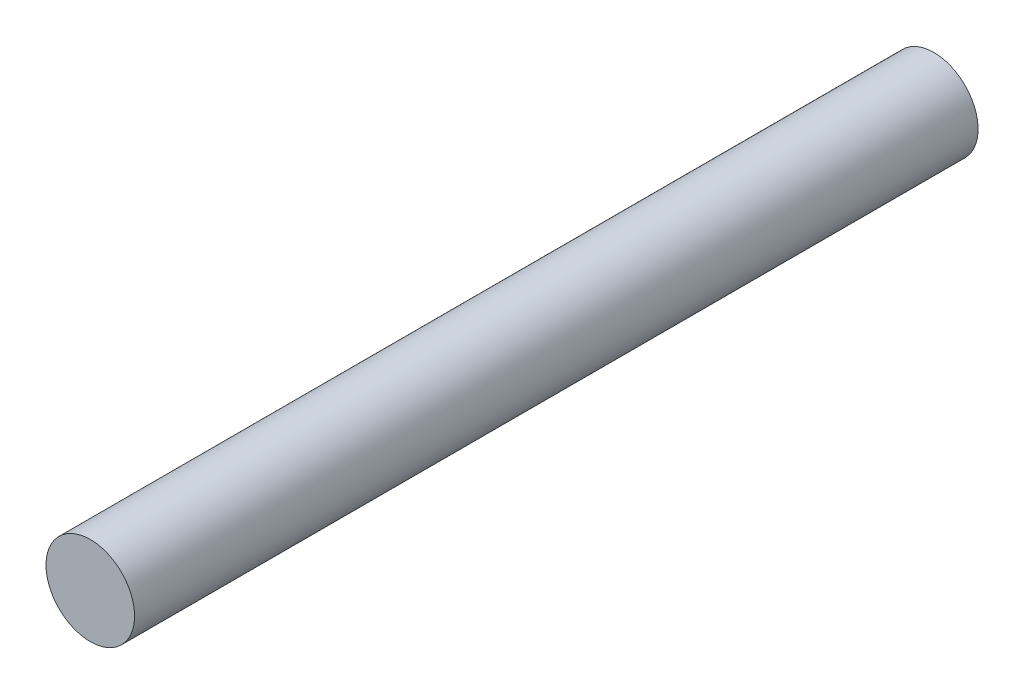
ISO-10303-21;
HEADER;
FILE_DESCRIPTION(('STEP AP214'),'2;1');
FILE_NAME('part.step','',(''),(''),'','','');
FILE_SCHEMA(('AUTOMOTIVE_DESIGN { 1 0 10303 214 1 1 1 1 }'));
ENDSEC;
DATA;
#1=APPLICATION_CONTEXT('core data for automotive mechanical design processes');
#2=APPLICATION_PROTOCOL_DEFINITION('international standard','automotive_design',2000,#1);
#3=PRODUCT_CONTEXT('',#1,'mechanical');
#4=PRODUCT('Part','Part','',(#3));
#5=PRODUCT_RELATED_PRODUCT_CATEGORY('part','',(#4));
#6=PRODUCT_DEFINITION_FORMATION('','',#4);
#7=PRODUCT_DEFINITION_CONTEXT('part definition',#1,'design');
#8=PRODUCT_DEFINITION('design','',#6,#7);
#9=PRODUCT_DEFINITION_SHAPE('','',#8);
#10=(LENGTH_UNIT() NAMED_UNIT(*) SI_UNIT(.MILLI.,.METRE.));
#11=(NAMED_UNIT(*) PLANE_ANGLE_UNIT() SI_UNIT($,.RADIAN.));
#12=(NAMED_UNIT(*) SI_UNIT($,.STERADIAN.) SOLID_ANGLE_UNIT());
#13=UNCERTAINTY_MEASURE_WITH_UNIT(LENGTH_MEASURE(1.E-05),#10,'distance_accuracy_value','');
#14=(GEOMETRIC_REPRESENTATION_CONTEXT(3) GLOBAL_UNCERTAINTY_ASSIGNED_CONTEXT((#13)) GLOBAL_UNIT_ASSIGNED_CONTEXT((#10,
#11,#12)) REPRESENTATION_CONTEXT('',''));
#15=CARTESIAN_POINT('',(0.,0.,0.));
#16=DIRECTION('',(0.,0.,1.));
#17=DIRECTION('',(1.,0.,0.));
#18=AXIS2_PLACEMENT_3D('',#15,#16,#17);
#19=CARTESIAN_POINT('',(0.,0.,19.05));
#20=DIRECTION('',(0.,0.,-1.));
#21=DIRECTION('',(-1.,0.,0.));
#22=AXIS2_PLACEMENT_3D('',#19,#20,#21);
#23=CYLINDRICAL_SURFACE('',#22,2.);
#24=CARTESIAN_POINT('',(0.,0.,19.05));
#25=DIRECTION('',(0.,0.,1.));
#26=DIRECTION('',(1.,0.,0.));
#27=AXIS2_PLACEMENT_3D('',#24,#25,#26);
#28=CIRCLE('',#27,2.);
#29=CARTESIAN_POINT('',(-2.,0.,19.05));
#30=VERTEX_POINT('',#29);
#31=EDGE_CURVE('E10',#30,#30,#28,.T.);
#32=CARTESIAN_POINT('',(0.,0.,-19.05));
#33=DIRECTION('',(0.,0.,1.));
#34=DIRECTION('',(1.,0.,0.));
#35=AXIS2_PLACEMENT_3D('',#32,#33,#34);
#36=CIRCLE('',#35,2.);
#37=CARTESIAN_POINT('',(-2.,0.,-19.05));
#38=VERTEX_POINT('',#37);
#39=EDGE_CURVE('E37',#38,#38,#36,.T.);
#40=CARTESIAN_POINT('',(-2.,0.,19.05));
#41=CARTESIAN_POINT('',(-2.,0.,18.653125));
#42=CARTESIAN_POINT('',(-2.,0.,18.25625));
#43=CARTESIAN_POINT('',(-2.,0.,17.4625));
#44=CARTESIAN_POINT('',(-2.,0.,17.065625));
#45=CARTESIAN_POINT('',(-2.,0.,16.271875));
#46=CARTESIAN_POINT('',(-2.,0.,15.875));
#47=CARTESIAN_POINT('',(-2.,0.,15.08125));
#48=CARTESIAN_POINT('',(-2.,0.,14.684375));
#49=CARTESIAN_POINT('',(-2.,0.,13.890625));
#50=CARTESIAN_POINT('',(-2.,0.,13.49375));
#51=CARTESIAN_POINT('',(-2.,0.,12.7));
#52=CARTESIAN_POINT('',(-2.,0.,12.303125));
#53=CARTESIAN_POINT('',(-2.,0.,11.509375));
#54=CARTESIAN_POINT('',(-2.,0.,11.1125));
#55=CARTESIAN_POINT('',(-2.,0.,10.31875));
#56=CARTESIAN_POINT('',(-2.,0.,9.921875));
#57=CARTESIAN_POINT('',(-2.,0.,9.128125));
#58=CARTESIAN_POINT('',(-2.,0.,8.73125));
#59=CARTESIAN_POINT('',(-2.,0.,7.9375));
#60=CARTESIAN_POINT('',(-2.,0.,7.540625));
#61=CARTESIAN_POINT('',(-2.,0.,6.746875));
#62=CARTESIAN_POINT('',(-2.,0.,6.35));
#63=CARTESIAN_POINT('',(-2.,0.,5.55625));
#64=CARTESIAN_POINT('',(-2.,0.,5.159375));
#65=CARTESIAN_POINT('',(-2.,0.,4.365625));
#66=CARTESIAN_POINT('',(-2.,0.,3.96875));
#67=CARTESIAN_POINT('',(-2.,0.,3.175));
#68=CARTESIAN_POINT('',(-2.,0.,2.778125));
#69=CARTESIAN_POINT('',(-2.,0.,1.984375));
#70=CARTESIAN_POINT('',(-2.,0.,1.5875));
#71=CARTESIAN_POINT('',(-2.,0.,0.793749999999997));
#72=CARTESIAN_POINT('',(-2.,0.,0.396874999999997));
#73=CARTESIAN_POINT('',(-2.,0.,-0.396875000000004));
#74=CARTESIAN_POINT('',(-2.,0.,-0.793750000000004));
#75=CARTESIAN_POINT('',(-2.,0.,-1.5875));
#76=CARTESIAN_POINT('',(-2.,0.,-1.984375));
#77=CARTESIAN_POINT('',(-2.,0.,-2.77812500000001));
#78=CARTESIAN_POINT('',(-2.,0.,-3.17500000000001));
#79=CARTESIAN_POINT('',(-2.,0.,-3.96875000000001));
#80=CARTESIAN_POINT('',(-2.,0.,-4.36562500000001));
#81=CARTESIAN_POINT('',(-2.,0.,-5.15937500000001));
#82=CARTESIAN_POINT('',(-2.,0.,-5.55625));
#83=CARTESIAN_POINT('',(-2.,0.,-6.35));
#84=CARTESIAN_POINT('',(-2.,0.,-6.746875));
#85=CARTESIAN_POINT('',(-2.,0.,-7.540625));
#86=CARTESIAN_POINT('',(-2.,0.,-7.93750000000001));
#87=CARTESIAN_POINT('',(-2.,0.,-8.73125));
#88=CARTESIAN_POINT('',(-2.,0.,-9.12812500000001));
#89=CARTESIAN_POINT('',(-2.,0.,-9.92187500000001));
#90=CARTESIAN_POINT('',(-2.,0.,-10.31875));
#91=CARTESIAN_POINT('',(-2.,0.,-11.1125));
#92=CARTESIAN_POINT('',(-2.,0.,-11.509375));
#93=CARTESIAN_POINT('',(-2.,0.,-12.303125));
#94=CARTESIAN_POINT('',(-2.,0.,-12.7));
#95=CARTESIAN_POINT('',(-2.,0.,-13.49375));
#96=CARTESIAN_POINT('',(-2.,0.,-13.890625));
#97=CARTESIAN_POINT('',(-2.,0.,-14.684375));
#98=CARTESIAN_POINT('',(-2.,0.,-15.08125));
#99=CARTESIAN_POINT('',(-2.,0.,-15.875));
#100=CARTESIAN_POINT('',(-2.,0.,-16.271875));
#101=CARTESIAN_POINT('',(-2.,0.,-17.065625));
#102=CARTESIAN_POINT('',(-2.,0.,-17.4625));
#103=CARTESIAN_POINT('',(-2.,0.,-18.25625));
#104=CARTESIAN_POINT('',(-2.,0.,-18.653125));
#105=CARTESIAN_POINT('',(-2.,0.,-19.05));
#106=B_SPLINE_CURVE_WITH_KNOTS('',3,(#40,#41,#42,#43,#44,#45,#46,#47,#48,#49,#50,#51,#52,#53,
#54,#55,#56,#57,#58,#59,#60,#61,#62,#63,#64,#65,#66,#67,#68,#69,#70,#71,#72,#73,#74,#75,#76,#77,
#78,#79,#80,#81,#82,#83,#84,#85,#86,#87,#88,#89,#90,#91,#92,#93,#94,#95,#96,#97,#98,#99,#100,
#101,#102,#103,#104,#105),.UNSPECIFIED.,.F.,.F.,(4,2,2,2,2,2,2,2,2,2,2,2,2,2,2,2,2,2,2,2,2,2,2,
2,2,2,2,2,2,2,2,2,4),(0.,1.190625,2.38125,3.571875,4.7625,5.953125,7.14375,8.334375,9.525,
10.715625,11.90625,13.096875,14.2875,15.478125,16.66875,17.859375,19.05,20.240625,21.43125,
22.621875,23.8125,25.003125,26.19375,27.384375,28.575,29.765625,30.95625,32.146875,33.3375,
34.528125,35.71875,36.909375,38.1),.UNSPECIFIED.);
#107=EDGE_CURVE('BSEAM34',#30,#38,#106,.T.);
#108=ORIENTED_EDGE('',*,*,#31,.F.);
#109=ORIENTED_EDGE('',*,*,#39,.T.);
#110=ORIENTED_EDGE('',*,*,#107,.T.);
#111=ORIENTED_EDGE('',*,*,#107,.F.);
#112=EDGE_LOOP('',(#108,#110,#109,#111));
#113=FACE_BOUND('',#112,.T.);
#114=ADVANCED_FACE('F34',(#113),#23,.T.);
#115=CARTESIAN_POINT('',(0.,0.,19.05));
#116=DIRECTION('',(0.,0.,1.));
#117=DIRECTION('',(1.,0.,0.));
#118=AXIS2_PLACEMENT_3D('',#115,#116,#117);
#119=PLANE('',#118);
#120=ORIENTED_EDGE('',*,*,#31,.T.);
#121=EDGE_LOOP('',(#120));
#122=FACE_BOUND('',#121,.T.);
#123=ADVANCED_FACE('F49',(#122),#119,.T.);
#124=CARTESIAN_POINT('',(0.,0.,-19.05));
#125=DIRECTION('',(0.,0.,1.));
#126=DIRECTION('',(1.,0.,0.));
#127=AXIS2_PLACEMENT_3D('',#124,#125,#126);
#128=PLANE('',#127);
#129=ORIENTED_EDGE('',*,*,#39,.F.);
#130=EDGE_LOOP('',(#129));
#131=FACE_BOUND('',#130,.T.);
#132=ADVANCED_FACE('F47',(#131),#128,.F.);
#133=CLOSED_SHELL('',(#114,#123,#132));
#134=MANIFOLD_SOLID_BREP('B2',#133);
#135=ADVANCED_BREP_SHAPE_REPRESENTATION('',(#18,#134),#14);
#136=SHAPE_DEFINITION_REPRESENTATION(#9,#135);
ENDSEC;
END-ISO-10303-21;
